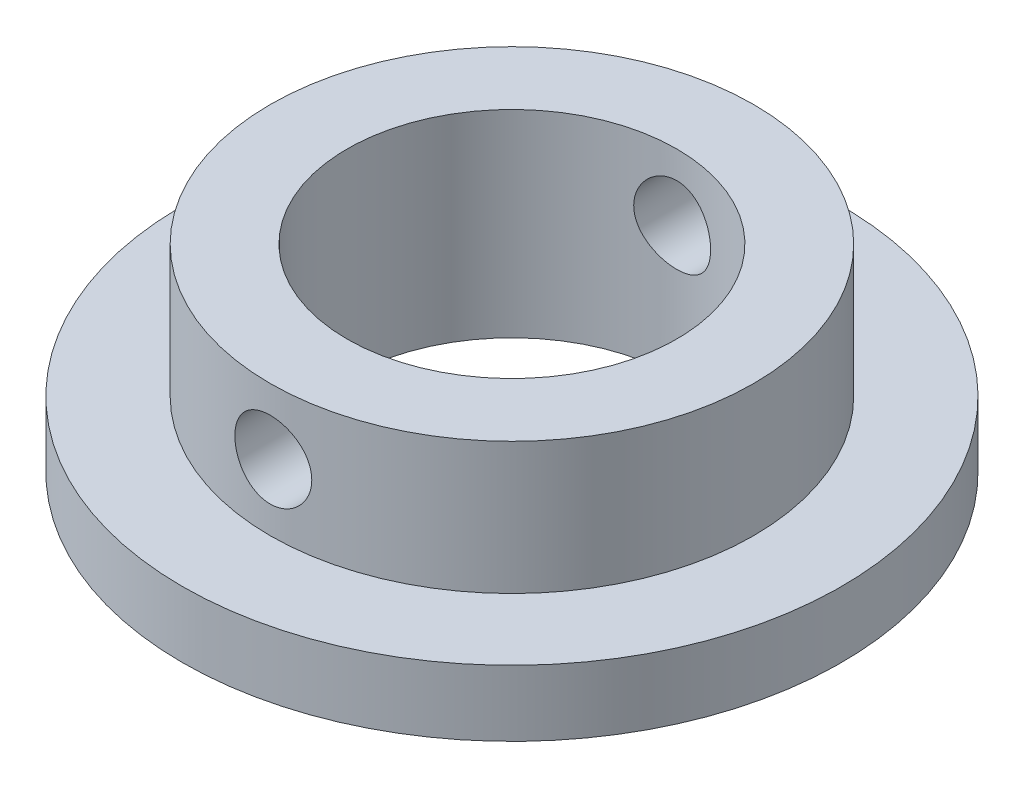
ISO-10303-21;
HEADER;
FILE_DESCRIPTION(('STEP AP214'),'2;1');
FILE_NAME('part.step','',(''),(''),'','','');
FILE_SCHEMA(('AUTOMOTIVE_DESIGN { 1 0 10303 214 1 1 1 1 }'));
ENDSEC;
DATA;
#1=APPLICATION_CONTEXT('core data for automotive mechanical design processes');
#2=APPLICATION_PROTOCOL_DEFINITION('international standard','automotive_design',2000,#1);
#3=PRODUCT_CONTEXT('',#1,'mechanical');
#4=PRODUCT('Part','Part','',(#3));
#5=PRODUCT_RELATED_PRODUCT_CATEGORY('part','',(#4));
#6=PRODUCT_DEFINITION_FORMATION('','',#4);
#7=PRODUCT_DEFINITION_CONTEXT('part definition',#1,'design');
#8=PRODUCT_DEFINITION('design','',#6,#7);
#9=PRODUCT_DEFINITION_SHAPE('','',#8);
#10=(LENGTH_UNIT() NAMED_UNIT(*) SI_UNIT(.MILLI.,.METRE.));
#11=(NAMED_UNIT(*) PLANE_ANGLE_UNIT() SI_UNIT($,.RADIAN.));
#12=(NAMED_UNIT(*) SI_UNIT($,.STERADIAN.) SOLID_ANGLE_UNIT());
#13=UNCERTAINTY_MEASURE_WITH_UNIT(LENGTH_MEASURE(1.E-05),#10,'distance_accuracy_value','');
#14=(GEOMETRIC_REPRESENTATION_CONTEXT(3) GLOBAL_UNCERTAINTY_ASSIGNED_CONTEXT((#13)) GLOBAL_UNIT_ASSIGNED_CONTEXT((#10,
#11,#12)) REPRESENTATION_CONTEXT('',''));
#15=CARTESIAN_POINT('',(0.,0.,0.));
#16=DIRECTION('',(0.,0.,1.));
#17=DIRECTION('',(1.,0.,0.));
#18=AXIS2_PLACEMENT_3D('',#15,#16,#17);
#19=CARTESIAN_POINT('',(0.,3.,0.));
#20=DIRECTION('',(0.,1.,0.));
#21=DIRECTION('',(0.,0.,1.));
#22=AXIS2_PLACEMENT_3D('',#19,#20,#21);
#23=PLANE('',#22);
#24=CARTESIAN_POINT('',(0.,3.,0.));
#25=DIRECTION('',(0.,1.,0.));
#26=DIRECTION('',(0.,0.,1.));
#27=AXIS2_PLACEMENT_3D('',#24,#25,#26);
#28=CIRCLE('',#27,15.);
#29=CARTESIAN_POINT('',(0.,3.,15.));
#30=VERTEX_POINT('',#29);
#31=EDGE_CURVE('E10',#30,#30,#28,.T.);
#32=ORIENTED_EDGE('',*,*,#31,.T.);
#33=EDGE_LOOP('',(#32));
#34=FACE_BOUND('',#33,.T.);
#35=CARTESIAN_POINT('',(0.,3.,0.));
#36=DIRECTION('',(0.,1.,0.));
#37=DIRECTION('',(0.,0.,1.));
#38=AXIS2_PLACEMENT_3D('',#35,#36,#37);
#39=CIRCLE('',#38,11.);
#40=CARTESIAN_POINT('',(0.,3.,11.));
#41=VERTEX_POINT('',#40);
#42=EDGE_CURVE('E103',#41,#41,#39,.T.);
#43=ORIENTED_EDGE('',*,*,#42,.F.);
#44=EDGE_LOOP('',(#43));
#45=FACE_BOUND('',#44,.T.);
#46=ADVANCED_FACE('F30',(#34,#45),#23,.T.);
#47=CARTESIAN_POINT('',(0.,0.,0.));
#48=DIRECTION('',(0.,1.,0.));
#49=DIRECTION('',(0.,0.,1.));
#50=AXIS2_PLACEMENT_3D('',#47,#48,#49);
#51=PLANE('',#50);
#52=CARTESIAN_POINT('',(0.,0.,0.));
#53=DIRECTION('',(0.,1.,0.));
#54=DIRECTION('',(0.,0.,1.));
#55=AXIS2_PLACEMENT_3D('',#52,#53,#54);
#56=CIRCLE('',#55,15.);
#57=CARTESIAN_POINT('',(0.,0.,15.));
#58=VERTEX_POINT('',#57);
#59=EDGE_CURVE('E43',#58,#58,#56,.T.);
#60=ORIENTED_EDGE('',*,*,#59,.F.);
#61=EDGE_LOOP('',(#60));
#62=FACE_BOUND('',#61,.T.);
#63=CARTESIAN_POINT('',(0.,0.,0.));
#64=DIRECTION('',(0.,1.,0.));
#65=DIRECTION('',(0.,0.,1.));
#66=AXIS2_PLACEMENT_3D('',#63,#64,#65);
#67=CIRCLE('',#66,7.5);
#68=CARTESIAN_POINT('',(0.,0.,7.5));
#69=VERTEX_POINT('',#68);
#70=EDGE_CURVE('E48',#69,#69,#67,.T.);
#71=ORIENTED_EDGE('',*,*,#70,.T.);
#72=EDGE_LOOP('',(#71));
#73=FACE_BOUND('',#72,.T.);
#74=ADVANCED_FACE('F89',(#62,#73),#51,.F.);
#75=CARTESIAN_POINT('',(0.,3.,0.));
#76=DIRECTION('',(0.,-1.,0.));
#77=DIRECTION('',(0.,0.,-1.));
#78=AXIS2_PLACEMENT_3D('',#75,#76,#77);
#79=CYLINDRICAL_SURFACE('',#78,15.);
#80=ORIENTED_EDGE('',*,*,#31,.F.);
#81=EDGE_LOOP('',(#80));
#82=FACE_BOUND('',#81,.T.);
#83=ORIENTED_EDGE('',*,*,#59,.T.);
#84=EDGE_LOOP('',(#83));
#85=FACE_BOUND('',#84,.T.);
#86=ADVANCED_FACE('F32',(#82,#85),#79,.T.);
#87=CARTESIAN_POINT('',(0.,3.,0.));
#88=DIRECTION('',(0.,-1.,0.));
#89=DIRECTION('',(0.,0.,-1.));
#90=AXIS2_PLACEMENT_3D('',#87,#88,#89);
#91=CYLINDRICAL_SURFACE('',#90,7.5);
#92=CARTESIAN_POINT('',(0.,7.75,-7.5));
#93=CARTESIAN_POINT('',(-0.0968920689760757,7.74999693812227,-7.49999825577596));
#94=CARTESIAN_POINT('',(-0.193819815225523,7.74192594869552,-7.4981034715083));
#95=CARTESIAN_POINT('',(-0.384910889611755,7.70989542336606,-7.49072806388341));
#96=CARTESIAN_POINT('',(-0.479072385923468,7.68592559627315,-7.48524511796865));
#97=CARTESIAN_POINT('',(-0.661842669774766,7.62289788780829,-7.47130237255715));
#98=CARTESIAN_POINT('',(-0.750457525699834,7.5838568429205,-7.46284589581215));
#99=CARTESIAN_POINT('',(-0.91987807027651,7.49185104256511,-7.44386329828026));
#100=CARTESIAN_POINT('',(-1.00068374709176,7.43888626599379,-7.43333717435647));
#101=CARTESIAN_POINT('',(-1.15365744906099,7.31952205002359,-7.41115055069133));
#102=CARTESIAN_POINT('',(-1.22566380724544,7.25291831728686,-7.39947439919204));
#103=CARTESIAN_POINT('',(-1.35759154808836,7.10860487112202,-7.37641108271656));
#104=CARTESIAN_POINT('',(-1.41751172990911,7.03089405544462,-7.36502394655403));
#105=CARTESIAN_POINT('',(-1.52430064665384,6.86534997868911,-7.34367214380394));
#106=CARTESIAN_POINT('',(-1.57099333387897,6.77740034459437,-7.33372745319133));
#107=CARTESIAN_POINT('',(-1.6488712963096,6.59463163908058,-7.31661287650471));
#108=CARTESIAN_POINT('',(-1.68005870369203,6.4998135142237,-7.30944260894164));
#109=CARTESIAN_POINT('',(-1.72549870554403,6.30776422791607,-7.29884882817841));
#110=CARTESIAN_POINT('',(-1.74003958773343,6.21060486887596,-7.29536161619364));
#111=CARTESIAN_POINT('',(-1.75267090949772,6.01516798888694,-7.29233777147282));
#112=CARTESIAN_POINT('',(-1.75076366258806,5.91689062713292,-7.29280058314518));
#113=CARTESIAN_POINT('',(-1.73078396258508,5.72418012856786,-7.29756700759255));
#114=CARTESIAN_POINT('',(-1.71305023914493,5.62970957670082,-7.30179013507032));
#115=CARTESIAN_POINT('',(-1.66245929848704,5.44512267549191,-7.31347364560974));
#116=CARTESIAN_POINT('',(-1.62960112866058,5.35500660081059,-7.32093423258011));
#117=CARTESIAN_POINT('',(-1.54939319136076,5.18075439387793,-7.33832888287955));
#118=CARTESIAN_POINT('',(-1.50191650068999,5.0966789216871,-7.34828446187752));
#119=CARTESIAN_POINT('',(-1.39390822624992,4.93756444236852,-7.36953464123461));
#120=CARTESIAN_POINT('',(-1.33337463263883,4.86252682920768,-7.38082944761958));
#121=CARTESIAN_POINT('',(-1.19919515127698,4.72167188592807,-7.40382788817507));
#122=CARTESIAN_POINT('',(-1.12526218832138,4.65612824571926,-7.41553472758942));
#123=CARTESIAN_POINT('',(-0.96731748819455,4.53832184429228,-7.43778511341053));
#124=CARTESIAN_POINT('',(-0.883305516240614,4.48605939253756,-7.44832863270767));
#125=CARTESIAN_POINT('',(-0.70722813373052,4.39621663530331,-7.46710641661403));
#126=CARTESIAN_POINT('',(-0.615141740504015,4.35867605897876,-7.47533441580223));
#127=CARTESIAN_POINT('',(-0.425732018971084,4.29968036066866,-7.48850806607517));
#128=CARTESIAN_POINT('',(-0.32840956288273,4.27822256846628,-7.49345426202045));
#129=CARTESIAN_POINT('',(-0.133634485575037,4.25240857958449,-7.49942805503466));
#130=CARTESIAN_POINT('',(-0.0362338958190521,4.24767905714858,-7.50054117979009));
#131=CARTESIAN_POINT('',(0.157966056910929,4.25443854328843,-7.49896485478385));
#132=CARTESIAN_POINT('',(0.254765466038352,4.2659262909895,-7.49627570064511));
#133=CARTESIAN_POINT('',(0.443751070191777,4.30448538128486,-7.4874513357351));
#134=CARTESIAN_POINT('',(0.535980185830077,4.33135735996885,-7.4813602349345));
#135=CARTESIAN_POINT('',(0.714619874430141,4.39969793420963,-7.46641550234956));
#136=CARTESIAN_POINT('',(0.801029906312503,4.44116788491213,-7.45756161410129));
#137=CARTESIAN_POINT('',(0.967096082040951,4.53828037693184,-7.43786494800546));
#138=CARTESIAN_POINT('',(1.04662310111654,4.59413763315299,-7.42699280446074));
#139=CARTESIAN_POINT('',(1.19530848786501,4.71816023470523,-7.40451901177755));
#140=CARTESIAN_POINT('',(1.26446530674697,4.78632741518087,-7.39291725403761));
#141=CARTESIAN_POINT('',(1.39195179817296,4.93475786942582,-7.36999067066486));
#142=CARTESIAN_POINT('',(1.45002132371628,5.01524662849627,-7.35867690401401));
#143=CARTESIAN_POINT('',(1.55182334690519,5.18505101455261,-7.33788489047587));
#144=CARTESIAN_POINT('',(1.59555648414632,5.27436624752774,-7.32840656171112));
#145=CARTESIAN_POINT('',(1.66713168175486,5.45880057499535,-7.31245631829528));
#146=CARTESIAN_POINT('',(1.69506657175421,5.55388205225423,-7.30596688379596));
#147=CARTESIAN_POINT('',(1.73451374261782,5.74756310468811,-7.29670338236506));
#148=CARTESIAN_POINT('',(1.74602907461822,5.84616202274933,-7.29392862516582));
#149=CARTESIAN_POINT('',(1.75216673875871,6.041445686875,-7.29245633350649));
#150=CARTESIAN_POINT('',(1.74720293679523,6.13811689556095,-7.29365890731389));
#151=CARTESIAN_POINT('',(1.72145838535238,6.32920379973859,-7.29977758521158));
#152=CARTESIAN_POINT('',(1.70067787825835,6.4236195297718,-7.30469363239422));
#153=CARTESIAN_POINT('',(1.64410189522673,6.60713186307548,-7.31763341770559));
#154=CARTESIAN_POINT('',(1.60837453100366,6.69625052681473,-7.3256430460587));
#155=CARTESIAN_POINT('',(1.52297483551587,6.86728749493974,-7.34387130010679));
#156=CARTESIAN_POINT('',(1.47330082676528,6.94920493161314,-7.35409019149527));
#157=CARTESIAN_POINT('',(1.36007929334344,7.10553637885222,-7.37587784566718));
#158=CARTESIAN_POINT('',(1.29624027185383,7.17973575511241,-7.38747214966726));
#159=CARTESIAN_POINT('',(1.15708154748275,7.31650382701021,-7.41054163753682));
#160=CARTESIAN_POINT('',(1.08175916827682,7.37906980378988,-7.42201679296977));
#161=CARTESIAN_POINT('',(0.920389220167818,7.49171476577147,-7.44376280686385));
#162=CARTESIAN_POINT('',(0.834195898350606,7.54158926737129,-7.45401268438621));
#163=CARTESIAN_POINT('',(0.654422829609415,7.62606196077446,-7.47193835175222));
#164=CARTESIAN_POINT('',(0.560848945048674,7.66067213578073,-7.47961615964697));
#165=CARTESIAN_POINT('',(0.389410230226078,7.70792526950698,-7.49026740611945));
#166=CARTESIAN_POINT('',(0.312426185720359,7.72367143485134,-7.49389343265844));
#167=CARTESIAN_POINT('',(0.156969176166678,7.74470974292148,-7.49876036826803));
#168=CARTESIAN_POINT('',(0.0784962961053612,7.75000248055453,-7.50000141306846));
#169=CARTESIAN_POINT('',(0.,7.75,-7.5));
#170=B_SPLINE_CURVE_WITH_KNOTS('',3,(#92,#93,#94,#95,#96,#97,#98,#99,#100,#101,#102,#103,#104,
#105,#106,#107,#108,#109,#110,#111,#112,#113,#114,#115,#116,#117,#118,#119,#120,#121,#122,#123,
#124,#125,#126,#127,#128,#129,#130,#131,#132,#133,#134,#135,#136,#137,#138,#139,#140,#141,#142,
#143,#144,#145,#146,#147,#148,#149,#150,#151,#152,#153,#154,#155,#156,#157,#158,#159,#160,#161,
#162,#163,#164,#165,#166,#167,#168,#169),.UNSPECIFIED.,.T.,.F.,(4,2,2,2,2,2,2,2,2,2,2,2,2,2,2,2,
2,2,2,2,2,2,2,2,2,2,2,2,2,2,2,2,2,2,2,2,2,2,4),(0.,0.290388732399198,0.580965614771191,
0.871218820495219,1.16147246614851,1.45644189297896,1.75144061245837,2.05019856191815,
2.34891541691671,2.64237682397785,2.93579695482906,3.22308381491298,3.51038877215024,
3.80026212118231,4.09018012214058,4.38726289257606,4.6843525846687,4.98223858898698,
5.2800751244742,5.57122135923558,5.86234495894804,6.14977863536887,6.43723900161202,
6.72926673904459,7.02133804751611,7.31959128203367,7.61783120863844,7.91429998398243,
8.21071366134324,8.49973992092952,8.78876175138095,9.07648063468675,9.36423413931506,
9.65857330060458,9.95298116608024,10.2518686566731,10.5505210872652,10.7857904701329,
11.0210464633731),.UNSPECIFIED.);
#171=CARTESIAN_POINT('',(0.,7.75,-7.5));
#172=VERTEX_POINT('',#171);
#173=EDGE_CURVE('E77',#172,#172,#170,.T.);
#174=ORIENTED_EDGE('',*,*,#173,.F.);
#175=EDGE_LOOP('',(#174));
#176=FACE_BOUND('',#175,.T.);
#177=CARTESIAN_POINT('',(1.75,6.,7.29297607290741));
#178=CARTESIAN_POINT('',(1.74999691121486,5.9031484123783,7.29297800893518));
#179=CARTESIAN_POINT('',(1.74193243452759,5.80626108510587,7.29492641392344));
#180=CARTESIAN_POINT('',(1.70993011922931,5.61525389017267,7.3024927037543));
#181=CARTESIAN_POINT('',(1.68598182198251,5.52113588863477,7.3081130063061));
#182=CARTESIAN_POINT('',(1.62301703909513,5.33845780144233,7.32235269223616));
#183=CARTESIAN_POINT('',(1.58401839673763,5.24989127809889,7.33096852300285));
#184=CARTESIAN_POINT('',(1.49211260074413,5.08055246756497,7.35022414270218));
#185=CARTESIAN_POINT('',(1.43920533220768,4.99978024477146,7.36086394835487));
#186=CARTESIAN_POINT('',(1.31990053028654,4.84677192109122,7.38319707914479));
#187=CARTESIAN_POINT('',(1.2532857659187,4.77470736245827,7.39490542720197));
#188=CARTESIAN_POINT('',(1.10892542263261,4.64266639651187,7.41792544005529));
#189=CARTESIAN_POINT('',(1.03117890314964,4.58269101169119,7.42923707123065));
#190=CARTESIAN_POINT('',(0.865600431056947,4.47584175363567,7.4503539477019));
#191=CARTESIAN_POINT('',(0.777658228910629,4.42913447823471,7.4601393966088));
#192=CARTESIAN_POINT('',(0.59490551332286,4.35122753367259,7.47693089106183));
#193=CARTESIAN_POINT('',(0.500095881084696,4.32002587891203,7.48393729246054));
#194=CARTESIAN_POINT('',(0.30808552868582,4.27455991240386,7.49427508053088));
#195=CARTESIAN_POINT('',(0.210957116045303,4.26000480772592,7.49766948813477));
#196=CARTESIAN_POINT('',(0.0155817884290646,4.24733429756632,7.50061975184774));
#197=CARTESIAN_POINT('',(-0.0826649800474687,4.24921676303894,7.50017610507374));
#198=CARTESIAN_POINT('',(-0.275478042541461,4.26915472990846,7.49554784718929));
#199=CARTESIAN_POINT('',(-0.370078768104857,4.28689660038757,7.49143578472275));
#200=CARTESIAN_POINT('',(-0.554921689175644,4.33754801505847,7.48001618746918));
#201=CARTESIAN_POINT('',(-0.645163670493071,4.3704583037947,7.47270849582506));
#202=CARTESIAN_POINT('',(-0.819578014218367,4.45077897776029,7.45560461806821));
#203=CARTESIAN_POINT('',(-0.903695136551196,4.4983049425984,7.44578870572467));
#204=CARTESIAN_POINT('',(-1.0628725542987,4.60642106030928,7.42473958086035));
#205=CARTESIAN_POINT('',(-1.13793145634496,4.66701321908675,7.41350615083412));
#206=CARTESIAN_POINT('',(-1.27872977581917,4.8012376648232,7.39053896048856));
#207=CARTESIAN_POINT('',(-1.34420698669887,4.87514431683085,7.37879965003309));
#208=CARTESIAN_POINT('',(-1.46189143870384,5.03301160987951,7.35638991886421));
#209=CARTESIAN_POINT('',(-1.51409821215242,5.11697260510228,7.34571953582998));
#210=CARTESIAN_POINT('',(-1.60389910082545,5.29302963503492,7.32663858626934));
#211=CARTESIAN_POINT('',(-1.64143758946765,5.38515504293547,7.31823665891522));
#212=CARTESIAN_POINT('',(-1.70041749564621,5.57465046004912,7.30475908797369));
#213=CARTESIAN_POINT('',(-1.721861861746,5.67201950508367,7.29968283511952));
#214=CARTESIAN_POINT('',(-1.74762540592416,5.86682614407328,7.29355731632272));
#215=CARTESIAN_POINT('',(-1.75232903411415,5.96421011215981,7.29241766492437));
#216=CARTESIAN_POINT('',(-1.74552372119433,6.15837089128158,7.29404956128176));
#217=CARTESIAN_POINT('',(-1.73401606181531,6.25514774970976,7.29682079982655));
#218=CARTESIAN_POINT('',(-1.69545004676237,6.44396878691271,7.30587629688283));
#219=CARTESIAN_POINT('',(-1.66860884705884,6.53605989383085,7.31211146543437));
#220=CARTESIAN_POINT('',(-1.60037532419597,6.71443700285603,7.32734694319755));
#221=CARTESIAN_POINT('',(-1.55898145420941,6.80072238670124,7.33634754633895));
#222=CARTESIAN_POINT('',(-1.46198984444796,6.96668677682359,7.35629458570697));
#223=CARTESIAN_POINT('',(-1.40615842122144,7.04622540901904,7.36727203523835));
#224=CARTESIAN_POINT('',(-1.28217762730628,7.19494600140345,7.38985672649086));
#225=CARTESIAN_POINT('',(-1.21402650464151,7.2641264860057,7.40146405762252));
#226=CARTESIAN_POINT('',(-1.06558989070294,7.39168851531705,7.42430240366142));
#227=CARTESIAN_POINT('',(-0.985075205098597,7.44980619100353,7.43551998051045));
#228=CARTESIAN_POINT('',(-0.81520374462249,7.55169271843849,7.45605467452934));
#229=CARTESIAN_POINT('',(-0.725847409601519,7.59546228350424,7.46537188616728));
#230=CARTESIAN_POINT('',(-0.541419656487201,7.66705739840157,7.48100007174939));
#231=CARTESIAN_POINT('',(-0.446392019695063,7.69499108328847,7.48733138363848));
#232=CARTESIAN_POINT('',(-0.252826481581441,7.73445398679072,7.49636287016946));
#233=CARTESIAN_POINT('',(-0.154289168063096,7.74598593926053,7.49906364994735));
#234=CARTESIAN_POINT('',(0.0410057930174497,7.7521810424285,7.50050874838961));
#235=CARTESIAN_POINT('',(0.137750533597033,7.74723602040565,7.4993449696472));
#236=CARTESIAN_POINT('',(0.32898960152753,7.72150346913288,7.49339172671828));
#237=CARTESIAN_POINT('',(0.423483980635915,7.7007163046099,7.48860234600248));
#238=CARTESIAN_POINT('',(0.607188231850142,7.64408786467573,7.47594625620643));
#239=CARTESIAN_POINT('',(0.696418322165902,7.60830913413294,7.46809234162874));
#240=CARTESIAN_POINT('',(0.867657352089334,7.52277171531946,7.45014037171465));
#241=CARTESIAN_POINT('',(0.949665489619465,7.47301147681338,7.44004206755177));
#242=CARTESIAN_POINT('',(1.10602054186471,7.35968318912134,7.41842885049258));
#243=CARTESIAN_POINT('',(1.1801673087093,7.29584386339221,7.40688836677777));
#244=CARTESIAN_POINT('',(1.31682912964441,7.15670762181302,7.38381847206244));
#245=CARTESIAN_POINT('',(1.37934131814026,7.08140789154672,7.37228906448377));
#246=CARTESIAN_POINT('',(1.49191307180048,6.92006671049711,7.35034314946524));
#247=CARTESIAN_POINT('',(1.54176192159397,6.83387529125726,7.339946936036));
#248=CARTESIAN_POINT('',(1.62618714943187,6.65410948829179,7.32170708592057));
#249=CARTESIAN_POINT('',(1.66077564937584,6.56054103433381,7.31386142453851));
#250=CARTESIAN_POINT('',(1.70798052325093,6.38915624955805,7.30296173657243));
#251=CARTESIAN_POINT('',(1.72370580247522,6.31222346966822,7.29924342453176));
#252=CARTESIAN_POINT('',(1.74471646048675,6.15686821208871,7.29424988616654));
#253=CARTESIAN_POINT('',(1.75000250178977,6.07844582925414,7.29297450480401));
#254=CARTESIAN_POINT('',(1.75,6.,7.29297607290741));
#255=B_SPLINE_CURVE_WITH_KNOTS('',3,(#177,#178,#179,#180,#181,#182,#183,#184,#185,#186,#187,
#188,#189,#190,#191,#192,#193,#194,#195,#196,#197,#198,#199,#200,#201,#202,#203,#204,#205,#206,
#207,#208,#209,#210,#211,#212,#213,#214,#215,#216,#217,#218,#219,#220,#221,#222,#223,#224,#225,
#226,#227,#228,#229,#230,#231,#232,#233,#234,#235,#236,#237,#238,#239,#240,#241,#242,#243,#244,
#245,#246,#247,#248,#249,#250,#251,#252,#253,#254),.UNSPECIFIED.,.T.,.F.,(4,2,2,2,2,2,2,2,2,2,2,
2,2,2,2,2,2,2,2,2,2,2,2,2,2,2,2,2,2,2,2,2,2,2,2,2,2,2,4),(0.,0.290267014023683,
0.580725343150865,0.870840365403749,1.16095778439899,1.45608637339859,1.75123991367709,
2.04995037963246,2.34862258383274,2.64199362879946,2.93532667599054,3.22298412892172,
3.5106557030727,3.8006633505479,4.09071555134698,4.38762339815684,4.68454170714155,
4.98257533883123,5.28055435519578,5.57164449350048,5.8627116183185,6.14975532473344,
6.43682955072413,6.72887792242813,7.02096785885331,7.31933164493485,7.61768059559088,
7.91396694700852,8.21020390738007,8.49944701890129,8.78868347150181,9.07672505792188,
9.36479859429994,9.65900183476419,9.95327744181983,10.2521691042319,10.550822915826,
10.7859422608756,11.021046683832),.UNSPECIFIED.);
#256=CARTESIAN_POINT('',(1.75,6.,7.29297607290741));
#257=VERTEX_POINT('',#256);
#258=EDGE_CURVE('E72',#257,#257,#255,.T.);
#259=ORIENTED_EDGE('',*,*,#258,.F.);
#260=EDGE_LOOP('',(#259));
#261=FACE_BOUND('',#260,.T.);
#262=ORIENTED_EDGE('',*,*,#70,.F.);
#263=EDGE_LOOP('',(#262));
#264=FACE_BOUND('',#263,.T.);
#265=CARTESIAN_POINT('',(0.,9.,0.));
#266=DIRECTION('',(0.,1.,0.));
#267=DIRECTION('',(0.,0.,1.));
#268=AXIS2_PLACEMENT_3D('',#265,#266,#267);
#269=CIRCLE('',#268,7.5);
#270=CARTESIAN_POINT('',(0.,9.,7.5));
#271=VERTEX_POINT('',#270);
#272=EDGE_CURVE('E108',#271,#271,#269,.T.);
#273=ORIENTED_EDGE('',*,*,#272,.T.);
#274=EDGE_LOOP('',(#273));
#275=FACE_BOUND('',#274,.T.);
#276=ADVANCED_FACE('F82',(#176,#261,#264,#275),#91,.F.);
#277=CARTESIAN_POINT('',(0.,9.,0.));
#278=DIRECTION('',(0.,1.,0.));
#279=DIRECTION('',(0.,0.,1.));
#280=AXIS2_PLACEMENT_3D('',#277,#278,#279);
#281=PLANE('',#280);
#282=CARTESIAN_POINT('',(0.,9.,0.));
#283=DIRECTION('',(0.,1.,0.));
#284=DIRECTION('',(0.,0.,1.));
#285=AXIS2_PLACEMENT_3D('',#282,#283,#284);
#286=CIRCLE('',#285,11.);
#287=CARTESIAN_POINT('',(0.,9.,11.));
#288=VERTEX_POINT('',#287);
#289=EDGE_CURVE('E101',#288,#288,#286,.T.);
#290=ORIENTED_EDGE('',*,*,#289,.T.);
#291=EDGE_LOOP('',(#290));
#292=FACE_BOUND('',#291,.T.);
#293=ORIENTED_EDGE('',*,*,#272,.F.);
#294=EDGE_LOOP('',(#293));
#295=FACE_BOUND('',#294,.T.);
#296=ADVANCED_FACE('F66',(#292,#295),#281,.T.);
#297=CARTESIAN_POINT('',(0.,9.,0.));
#298=DIRECTION('',(0.,-1.,0.));
#299=DIRECTION('',(0.,0.,-1.));
#300=AXIS2_PLACEMENT_3D('',#297,#298,#299);
#301=CYLINDRICAL_SURFACE('',#300,11.);
#302=CARTESIAN_POINT('',(0.,7.75,-11.));
#303=CARTESIAN_POINT('',(-0.0976373933604649,7.74999603095626,-10.999998373116));
#304=CARTESIAN_POINT('',(-0.195329649262211,7.74180120987806,-10.9986864575872));
#305=CARTESIAN_POINT('',(-0.387978550077337,7.7092495823347,-10.9935792644943));
#306=CARTESIAN_POINT('',(-0.482932521678908,7.68487750503694,-10.9897816405449));
#307=CARTESIAN_POINT('',(-0.667289377292459,7.62072222773006,-10.9801293648372));
#308=CARTESIAN_POINT('',(-0.756696577024931,7.58095118803371,-10.9742763365372));
#309=CARTESIAN_POINT('',(-0.927556135048116,7.48715780635215,-10.9611583024092));
#310=CARTESIAN_POINT('',(-1.00900949208581,7.43313725680849,-10.9538934742014));
#311=CARTESIAN_POINT('',(-1.16237395555459,7.31187540148819,-10.9386873337076));
#312=CARTESIAN_POINT('',(-1.23420541842827,7.24453396472762,-10.9307411733876));
#313=CARTESIAN_POINT('',(-1.36559947123725,7.09875742469801,-10.915105446609));
#314=CARTESIAN_POINT('',(-1.42516131957521,7.02032165135052,-10.9074158956838));
#315=CARTESIAN_POINT('',(-1.53064035728508,6.85404136951904,-10.8931170485399));
#316=CARTESIAN_POINT('',(-1.57647957592866,6.7661468150303,-10.8865140178553));
#317=CARTESIAN_POINT('',(-1.65271369429388,6.58378311786986,-10.875202615627));
#318=CARTESIAN_POINT('',(-1.68310954251592,6.48931437937645,-10.870494127728));
#319=CARTESIAN_POINT('',(-1.72734481297851,6.29732517050028,-10.8635529191995));
#320=CARTESIAN_POINT('',(-1.74132121239548,6.19983701423676,-10.8612997271969));
#321=CARTESIAN_POINT('',(-1.75274537977344,6.00387515929282,-10.8594621994682));
#322=CARTESIAN_POINT('',(-1.75019421399158,5.90540152459867,-10.859877691575));
#323=CARTESIAN_POINT('',(-1.728747412692,5.71123705456416,-10.8633118819526));
#324=CARTESIAN_POINT('',(-1.71000503447449,5.6155287966186,-10.8663061699191));
#325=CARTESIAN_POINT('',(-1.65694806660338,5.42863292459095,-10.8745223982518));
#326=CARTESIAN_POINT('',(-1.62263298636552,5.33744545302683,-10.8797444087972));
#327=CARTESIAN_POINT('',(-1.53924744143281,5.16171733142262,-10.8918543408345));
#328=CARTESIAN_POINT('',(-1.49011274169591,5.07720768025784,-10.8987494885118));
#329=CARTESIAN_POINT('',(-1.37852838245591,4.91757460062993,-10.9134236747886));
#330=CARTESIAN_POINT('',(-1.31607774188425,4.84245186440663,-10.9212027784949));
#331=CARTESIAN_POINT('',(-1.17879631149606,4.70283743106738,-10.9368759066559));
#332=CARTESIAN_POINT('',(-1.10383390025225,4.63847512009727,-10.9447702380602));
#333=CARTESIAN_POINT('',(-0.944103594378843,4.52322397653009,-10.9597030955193));
#334=CARTESIAN_POINT('',(-0.85933564654288,4.47233521704754,-10.9667416169299));
#335=CARTESIAN_POINT('',(-0.682283305746998,4.38546634721848,-10.9791785277408));
#336=CARTESIAN_POINT('',(-0.58999354843743,4.3494969902932,-10.9845757333889));
#337=CARTESIAN_POINT('',(-0.400578150894294,4.29360448446872,-10.9931122185142));
#338=CARTESIAN_POINT('',(-0.303452879462695,4.27368011381202,-10.9962516699078));
#339=CARTESIAN_POINT('',(-0.108239372326661,4.2506169929193,-10.9998959614233));
#340=CARTESIAN_POINT('',(-0.0101726375738429,4.24730050192606,-11.0004286976995));
#341=CARTESIAN_POINT('',(0.1851158514389,4.2570743934664,-10.9988757202125));
#342=CARTESIAN_POINT('',(0.282337635111362,4.27016420257877,-10.9967900979643));
#343=CARTESIAN_POINT('',(0.472632407682165,4.31223129902945,-10.9902520049669));
#344=CARTESIAN_POINT('',(0.565725190318669,4.34112124450496,-10.985812550095));
#345=CARTESIAN_POINT('',(0.745745902890351,4.41387589389196,-10.9750627415294));
#346=CARTESIAN_POINT('',(0.832673512333017,4.45774137560885,-10.9687522906616));
#347=CARTESIAN_POINT('',(0.998672825746619,4.55961362187235,-10.9548918222497));
#348=CARTESIAN_POINT('',(1.07767507939543,4.61773221828378,-10.9473321642307));
#349=CARTESIAN_POINT('',(1.22486843508931,4.74630621825206,-10.9318427143865));
#350=CARTESIAN_POINT('',(1.29305882508263,4.81676243370192,-10.9239128982277));
#351=CARTESIAN_POINT('',(1.41734598630714,4.96880613103287,-10.9084874805759));
#352=CARTESIAN_POINT('',(1.47332310146384,5.05049198520044,-10.9009966592317));
#353=CARTESIAN_POINT('',(1.57076090641851,5.22221170176822,-10.887384477566));
#354=CARTESIAN_POINT('',(1.61222202570843,5.31224531707937,-10.8812630767286));
#355=CARTESIAN_POINT('',(1.67926890554027,5.49775989194363,-10.8711181125682));
#356=CARTESIAN_POINT('',(1.70491581468562,5.59321829068738,-10.8670864785382));
#357=CARTESIAN_POINT('',(1.73979974289424,5.78715704257536,-10.8615567085211));
#358=CARTESIAN_POINT('',(1.7490380503499,5.88563715783869,-10.8600583736216));
#359=CARTESIAN_POINT('',(1.75080905956201,6.08163007010293,-10.8597728926152));
#360=CARTESIAN_POINT('',(1.74353000349722,6.17914117325722,-10.8609551961544));
#361=CARTESIAN_POINT('',(1.71287824859014,6.37153295443179,-10.8658310828554));
#362=CARTESIAN_POINT('',(1.68950558903475,6.46641363887273,-10.8695246598869));
#363=CARTESIAN_POINT('',(1.62739964241686,6.65078808520876,-10.8789957426943));
#364=CARTESIAN_POINT('',(1.58868114356887,6.7402869380237,-10.8847712417158));
#365=CARTESIAN_POINT('',(1.4970016220856,6.91154897085253,-10.8977575802945));
#366=CARTESIAN_POINT('',(1.44403999686087,6.99331182337859,-10.9049684805764));
#367=CARTESIAN_POINT('',(1.32470010063517,7.1477345038665,-10.9201106366554));
#368=CARTESIAN_POINT('',(1.25818289233427,7.22028629192007,-10.9280488411009));
#369=CARTESIAN_POINT('',(1.11391347409388,7.35326355769983,-10.9436945467352));
#370=CARTESIAN_POINT('',(1.03615866725757,7.41368622477585,-10.9514019941));
#371=CARTESIAN_POINT('',(0.871046981035362,7.52103131206395,-10.9657731616158));
#372=CARTESIAN_POINT('',(0.783633211418931,7.56786713656312,-10.9724300686828));
#373=CARTESIAN_POINT('',(0.602111577219292,7.64611970400357,-10.9838836349249));
#374=CARTESIAN_POINT('',(0.508010615989551,7.67755209096506,-10.9886821804434));
#375=CARTESIAN_POINT('',(0.344597521352024,7.71713845524629,-10.9948085998277));
#376=CARTESIAN_POINT('',(0.2762836778651,7.72944222398592,-10.9967451606233));
#377=CARTESIAN_POINT('',(0.138655770160675,7.74587434497259,-10.9993414289187));
#378=CARTESIAN_POINT('',(0.0693417208334073,7.7500028188004,-11.0000011554071));
#379=CARTESIAN_POINT('',(0.,7.75,-11.));
#380=B_SPLINE_CURVE_WITH_KNOTS('',3,(#302,#303,#304,#305,#306,#307,#308,#309,#310,#311,#312,
#313,#314,#315,#316,#317,#318,#319,#320,#321,#322,#323,#324,#325,#326,#327,#328,#329,#330,#331,
#332,#333,#334,#335,#336,#337,#338,#339,#340,#341,#342,#343,#344,#345,#346,#347,#348,#349,#350,
#351,#352,#353,#354,#355,#356,#357,#358,#359,#360,#361,#362,#363,#364,#365,#366,#367,#368,#369,
#370,#371,#372,#373,#374,#375,#376,#377,#378,#379),.UNSPECIFIED.,.T.,.F.,(4,2,2,2,2,2,2,2,2,2,2,
2,2,2,2,2,2,2,2,2,2,2,2,2,2,2,2,2,2,2,2,2,2,2,2,2,2,2,4),(0.,0.292658754706616,
0.585594163914544,0.878298716994369,1.17096646840016,1.46592402045674,1.76089939504514,
2.057520299113,2.35412298312543,2.6482333186256,2.94232468011933,3.23366245737481,
3.52500941323333,3.81763780567468,4.11028776533203,4.4062366683722,4.70218717735237,
4.99835062873026,5.29449152638738,5.58745618996923,5.88041061434621,6.17176174291016,
6.46312800608822,6.75685792626042,7.05060718297933,7.34711660119895,7.64361724570591,
7.9389641051845,8.23428777320074,8.52626267462877,8.81823686330478,9.10993036876561,
9.40163621695792,9.69649759824867,9.99142722833675,10.2881972495005,10.5846652375608,
10.7925135093703,11.0003586900932),.UNSPECIFIED.);
#381=CARTESIAN_POINT('',(0.,7.75,-11.));
#382=VERTEX_POINT('',#381);
#383=EDGE_CURVE('E34',#382,#382,#380,.T.);
#384=ORIENTED_EDGE('',*,*,#383,.T.);
#385=EDGE_LOOP('',(#384));
#386=FACE_BOUND('',#385,.T.);
#387=CARTESIAN_POINT('',(1.75,6.,10.8599033144867));
#388=CARTESIAN_POINT('',(1.74999602351449,5.90237142081327,10.8599050202225));
#389=CARTESIAN_POINT('',(1.74180263199442,5.80468795629614,10.8612340665884));
#390=CARTESIAN_POINT('',(1.70925719786309,5.61205731655215,10.8664023909473));
#391=CARTESIAN_POINT('',(1.68488985226502,5.51711282165905,10.8702440461948));
#392=CARTESIAN_POINT('',(1.62074841217435,5.33277602064125,10.8799917151822));
#393=CARTESIAN_POINT('',(1.58098670149069,5.24337931856152,10.8858960692373));
#394=CARTESIAN_POINT('',(1.48721530045946,5.07253740713568,10.8991018990682));
#395=CARTESIAN_POINT('',(1.43320738030878,4.99109121160181,10.906403201232));
#396=CARTESIAN_POINT('',(1.31195838163795,4.83771889749152,10.9216536295802));
#397=CARTESIAN_POINT('',(1.24461434215907,4.76587463553171,10.9296074947694));
#398=CARTESIAN_POINT('',(1.09882719150052,4.63445581269953,10.9452246596295));
#399=CARTESIAN_POINT('',(1.02038344548156,4.57488195410247,10.952887942649));
#400=CARTESIAN_POINT('',(0.854095944283666,4.46939016799285,10.9671103945702));
#401=CARTESIAN_POINT('',(0.766203514828373,4.42354805691779,10.9736633498016));
#402=CARTESIAN_POINT('',(0.583844427704123,4.34730800806728,10.9848741824688));
#403=CARTESIAN_POINT('',(0.489378160344209,4.31690915426598,10.9895321723023));
#404=CARTESIAN_POINT('',(0.297397475293058,4.27266788158046,10.996394799979));
#405=CARTESIAN_POINT('',(0.199915444552892,4.25868812896986,10.9986197772025));
#406=CARTESIAN_POINT('',(0.00396565422085668,4.24725513169296,11.0004354865584));
#407=CARTESIAN_POINT('',(-0.094502043686526,4.24980085921459,11.0000263825192));
#408=CARTESIAN_POINT('',(-0.288689986485355,4.27123886059668,10.9966361951852));
#409=CARTESIAN_POINT('',(-0.384427009250902,4.28998335953298,10.9936783636179));
#410=CARTESIAN_POINT('',(-0.571379308194359,4.34305446610537,10.9855489723233));
#411=CARTESIAN_POINT('',(-0.662594456340094,4.37738151466595,10.9803773499549));
#412=CARTESIAN_POINT('',(-0.838356860726604,4.46079222261985,10.9683616879054));
#413=CARTESIAN_POINT('',(-0.922874433837825,4.50993738841877,10.9615107001932));
#414=CARTESIAN_POINT('',(-1.08251895755455,4.62154429266118,10.9468985836945));
#415=CARTESIAN_POINT('',(-1.15764521358741,4.68400701513492,10.939137387672));
#416=CARTESIAN_POINT('',(-1.29724671483804,4.82129725965265,10.9234678194369));
#417=CARTESIAN_POINT('',(-1.36159499074275,4.89625387735633,10.9155587687921));
#418=CARTESIAN_POINT('',(-1.47682054256909,5.05596750661737,10.900568230917));
#419=CARTESIAN_POINT('',(-1.52769771464811,5.14072459371485,10.8934867500662));
#420=CARTESIAN_POINT('',(-1.61455814190066,5.31777349618366,10.8809530395656));
#421=CARTESIAN_POINT('',(-1.65052715633539,5.41007241548318,10.8755023690926));
#422=CARTESIAN_POINT('',(-1.70641619297437,5.59950779987472,10.8668740274264));
#423=CARTESIAN_POINT('',(-1.72633749560229,5.69664387836001,10.8636961748906));
#424=CARTESIAN_POINT('',(-1.74938900567876,5.89186318575943,10.8600080502371));
#425=CARTESIAN_POINT('',(-1.75269973742955,5.98992457468197,10.8594690999879));
#426=CARTESIAN_POINT('',(-1.7429162355239,6.18520100789494,10.8610435319367));
#427=CARTESIAN_POINT('',(-1.72982257698664,6.28241608173588,10.8631568211504));
#428=CARTESIAN_POINT('',(-1.68775551744605,6.47267349218408,10.8697711927051));
#429=CARTESIAN_POINT('',(-1.6588730930292,6.56573646188056,10.8742585904511));
#430=CARTESIAN_POINT('',(-1.58614341791475,6.74570085795152,10.8851041726175));
#431=CARTESIAN_POINT('',(-1.54229534421378,6.83260194514919,10.8914624599207));
#432=CARTESIAN_POINT('',(-1.44044941710107,6.99858192309197,10.90540047282));
#433=CARTESIAN_POINT('',(-1.38233533011448,7.07758865070693,10.9129900488559));
#434=CARTESIAN_POINT('',(-1.25376751021058,7.22479311941205,10.9285062785237));
#435=CARTESIAN_POINT('',(-1.18331298924099,7.29299016967294,10.936432953658));
#436=CARTESIAN_POINT('',(-1.03126666608954,7.41729353836012,10.9518204542953));
#437=CARTESIAN_POINT('',(-0.949576133625176,7.47327981647939,10.9592761837841));
#438=CARTESIAN_POINT('',(-0.77784444249646,7.57073367778287,10.9728011951792));
#439=CARTESIAN_POINT('',(-0.687803535067086,7.61220169759399,10.9788705187788));
#440=CARTESIAN_POINT('',(-0.502292101650055,7.67925277469196,10.9889166383317));
#441=CARTESIAN_POINT('',(-0.406845230647255,7.70489996061534,10.9929018718539));
#442=CARTESIAN_POINT('',(-0.212930937916665,7.73978834184678,10.998366338562));
#443=CARTESIAN_POINT('',(-0.114463742300821,7.74903076223768,10.9998457588777));
#444=CARTESIAN_POINT('',(0.0815348527070024,7.7508144985333,11.0001296234922));
#445=CARTESIAN_POINT('',(0.179064592054743,7.74353893344959,10.9989633976371));
#446=CARTESIAN_POINT('',(0.371494556275285,7.71288763516041,10.9941465376258));
#447=CARTESIAN_POINT('',(0.466394792790584,7.68951197325226,10.9904959144716));
#448=CARTESIAN_POINT('',(0.650811091661786,7.6273918568221,10.9811187509296));
#449=CARTESIAN_POINT('',(0.740332050318482,7.58866162996772,10.9753941327448));
#450=CARTESIAN_POINT('',(0.911633453197333,7.4969517572372,10.9624956923826));
#451=CARTESIAN_POINT('',(0.99341358364299,7.44397153406785,10.9553218114959));
#452=CARTESIAN_POINT('',(1.14783737978026,7.32461029577918,10.9402267124692));
#453=CARTESIAN_POINT('',(1.22037630439085,7.25809464902113,10.9322984496505));
#454=CARTESIAN_POINT('',(1.35332834197641,7.11383376334554,10.9166384672644));
#455=CARTESIAN_POINT('',(1.41373860956862,7.0360858966886,10.9089067941875));
#456=CARTESIAN_POINT('',(1.52106928559765,6.87098071003684,10.8944622770052));
#457=CARTESIAN_POINT('',(1.56790113558862,6.78356522575606,10.8877562504201));
#458=CARTESIAN_POINT('',(1.64614580747408,6.60204015765806,10.8762025415013));
#459=CARTESIAN_POINT('',(1.67757431324646,6.5079374950985,10.8713529700082));
#460=CARTESIAN_POINT('',(1.71715052977052,6.34453459577991,10.8651578498205));
#461=CARTESIAN_POINT('',(1.72944974900947,6.27623334572614,10.8631981157294));
#462=CARTESIAN_POINT('',(1.74587583228739,6.13863061268591,10.8605702524896));
#463=CARTESIAN_POINT('',(1.75000282382827,6.06932914532169,10.8599021031898));
#464=CARTESIAN_POINT('',(1.75,6.,10.8599033144867));
#465=B_SPLINE_CURVE_WITH_KNOTS('',3,(#387,#388,#389,#390,#391,#392,#393,#394,#395,#396,#397,
#398,#399,#400,#401,#402,#403,#404,#405,#406,#407,#408,#409,#410,#411,#412,#413,#414,#415,#416,
#417,#418,#419,#420,#421,#422,#423,#424,#425,#426,#427,#428,#429,#430,#431,#432,#433,#434,#435,
#436,#437,#438,#439,#440,#441,#442,#443,#444,#445,#446,#447,#448,#449,#450,#451,#452,#453,#454,
#455,#456,#457,#458,#459,#460,#461,#462,#463,#464),.UNSPECIFIED.,.T.,.F.,(4,2,2,2,2,2,2,2,2,2,2,
2,2,2,2,2,2,2,2,2,2,2,2,2,2,2,2,2,2,2,2,2,2,2,2,2,2,2,4),(0.,0.29263226969203,0.585541808832364,
0.878216208416044,1.1708542581585,1.46584647927617,1.76085557907491,2.05746468483529,
2.35405619499826,2.64814885713805,2.94222322818474,3.23364286058724,3.52507073952625,
3.81772531812802,4.11040152838701,4.40631424832306,4.70222924924937,4.99842626958544,
5.29459965444907,5.58754713563504,5.88048434670465,6.17175114603365,6.46303396552905,
6.7567737542921,7.05053230793523,7.3470601326896,7.64357903880177,7.93888798980205,
8.23417488665306,8.52620422721815,8.8182322745753,9.10999035640937,9.40176025967354,
9.69658815315313,9.99148513263878,10.2882642616701,10.584740575412,10.7925512580757,
11.0003586984819),.UNSPECIFIED.);
#466=CARTESIAN_POINT('',(1.75,6.,10.8599033144867));
#467=VERTEX_POINT('',#466);
#468=EDGE_CURVE('E52',#467,#467,#465,.T.);
#469=ORIENTED_EDGE('',*,*,#468,.T.);
#470=EDGE_LOOP('',(#469));
#471=FACE_BOUND('',#470,.T.);
#472=ORIENTED_EDGE('',*,*,#289,.F.);
#473=EDGE_LOOP('',(#472));
#474=FACE_BOUND('',#473,.T.);
#475=ORIENTED_EDGE('',*,*,#42,.T.);
#476=EDGE_LOOP('',(#475));
#477=FACE_BOUND('',#476,.T.);
#478=ADVANCED_FACE('F57',(#386,#471,#474,#477),#301,.T.);
#479=CARTESIAN_POINT('',(0.,6.,-15.));
#480=DIRECTION('',(0.,0.,1.));
#481=DIRECTION('',(1.,0.,0.));
#482=AXIS2_PLACEMENT_3D('',#479,#480,#481);
#483=CYLINDRICAL_SURFACE('',#482,1.75);
#484=ORIENTED_EDGE('',*,*,#258,.T.);
#485=EDGE_LOOP('',(#484));
#486=FACE_BOUND('',#485,.T.);
#487=ORIENTED_EDGE('',*,*,#468,.F.);
#488=EDGE_LOOP('',(#487));
#489=FACE_BOUND('',#488,.T.);
#490=ADVANCED_FACE('F64',(#486,#489),#483,.F.);
#491=ORIENTED_EDGE('',*,*,#173,.T.);
#492=EDGE_LOOP('',(#491));
#493=FACE_BOUND('',#492,.T.);
#494=ORIENTED_EDGE('',*,*,#383,.F.);
#495=EDGE_LOOP('',(#494));
#496=FACE_BOUND('',#495,.T.);
#497=ADVANCED_FACE('F61',(#493,#496),#483,.F.);
#498=CLOSED_SHELL('',(#46,#74,#86,#276,#296,#478,#490,#497));
#499=MANIFOLD_SOLID_BREP('B2',#498);
#500=ADVANCED_BREP_SHAPE_REPRESENTATION('',(#18,#499),#14);
#501=SHAPE_DEFINITION_REPRESENTATION(#9,#500);
ENDSEC;
END-ISO-10303-21;
